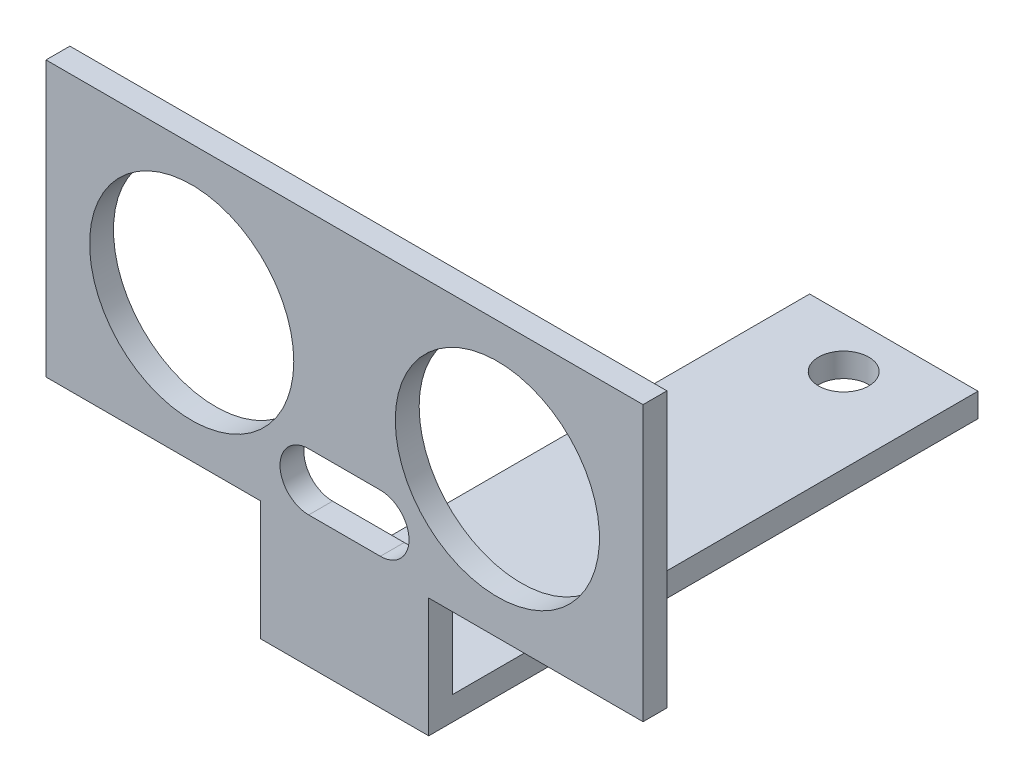
ISO-10303-21;
HEADER;
FILE_DESCRIPTION(('STEP AP214'),'2;1');
FILE_NAME('part.step','',(''),(''),'','','');
FILE_SCHEMA(('AUTOMOTIVE_DESIGN { 1 0 10303 214 1 1 1 1 }'));
ENDSEC;
DATA;
#1=APPLICATION_CONTEXT('core data for automotive mechanical design processes');
#2=APPLICATION_PROTOCOL_DEFINITION('international standard','automotive_design',2000,#1);
#3=PRODUCT_CONTEXT('',#1,'mechanical');
#4=PRODUCT('Part','Part','',(#3));
#5=PRODUCT_RELATED_PRODUCT_CATEGORY('part','',(#4));
#6=PRODUCT_DEFINITION_FORMATION('','',#4);
#7=PRODUCT_DEFINITION_CONTEXT('part definition',#1,'design');
#8=PRODUCT_DEFINITION('design','',#6,#7);
#9=PRODUCT_DEFINITION_SHAPE('','',#8);
#10=(LENGTH_UNIT() NAMED_UNIT(*) SI_UNIT(.MILLI.,.METRE.));
#11=(NAMED_UNIT(*) PLANE_ANGLE_UNIT() SI_UNIT($,.RADIAN.));
#12=(NAMED_UNIT(*) SI_UNIT($,.STERADIAN.) SOLID_ANGLE_UNIT());
#13=UNCERTAINTY_MEASURE_WITH_UNIT(LENGTH_MEASURE(1.E-05),#10,'distance_accuracy_value','');
#14=(GEOMETRIC_REPRESENTATION_CONTEXT(3) GLOBAL_UNCERTAINTY_ASSIGNED_CONTEXT((#13)) GLOBAL_UNIT_ASSIGNED_CONTEXT((#10,
#11,#12)) REPRESENTATION_CONTEXT('',''));
#15=CARTESIAN_POINT('',(0.,0.,0.));
#16=DIRECTION('',(0.,0.,1.));
#17=DIRECTION('',(1.,0.,0.));
#18=AXIS2_PLACEMENT_3D('',#15,#16,#17);
#19=CARTESIAN_POINT('',(0.,2.,0.));
#20=DIRECTION('',(1.,0.,0.));
#21=DIRECTION('',(0.,0.,-1.));
#22=AXIS2_PLACEMENT_3D('',#19,#20,#21);
#23=PLANE('',#22);
#24=DIRECTION('',(0.,0.,1.));
#25=VECTOR('',#24,1.);
#26=CARTESIAN_POINT('',(0.,0.,0.));
#27=LINE('',#26,#25);
#28=CARTESIAN_POINT('',(0.,0.,-46.));
#29=VERTEX_POINT('',#28);
#30=CARTESIAN_POINT('',(0.,0.,0.));
#31=VERTEX_POINT('',#30);
#32=EDGE_CURVE('E236',#29,#31,#27,.T.);
#33=ORIENTED_EDGE('',*,*,#32,.T.);
#34=DIRECTION('',(0.,-1.,0.));
#35=VECTOR('',#34,1.);
#36=CARTESIAN_POINT('',(0.,2.,0.));
#37=LINE('',#36,#35);
#38=CARTESIAN_POINT('',(0.,10.,0.));
#39=VERTEX_POINT('',#38);
#40=EDGE_CURVE('E11',#39,#31,#37,.T.);
#41=ORIENTED_EDGE('',*,*,#40,.F.);
#42=DIRECTION('',(0.,0.,1.));
#43=VECTOR('',#42,1.);
#44=CARTESIAN_POINT('',(0.,10.,-2.));
#45=LINE('',#44,#43);
#46=CARTESIAN_POINT('',(0.,10.,-2.));
#47=VERTEX_POINT('',#46);
#48=EDGE_CURVE('E217',#47,#39,#45,.T.);
#49=ORIENTED_EDGE('',*,*,#48,.F.);
#50=DIRECTION('',(0.,-1.,0.));
#51=VECTOR('',#50,1.);
#52=CARTESIAN_POINT('',(0.,0.,-2.));
#53=LINE('',#52,#51);
#54=CARTESIAN_POINT('',(0.,2.,-2.));
#55=VERTEX_POINT('',#54);
#56=EDGE_CURVE('E182',#47,#55,#53,.T.);
#57=ORIENTED_EDGE('',*,*,#56,.T.);
#58=DIRECTION('',(0.,0.,1.));
#59=VECTOR('',#58,1.);
#60=CARTESIAN_POINT('',(0.,2.,0.));
#61=LINE('',#60,#59);
#62=CARTESIAN_POINT('',(0.,2.,-46.));
#63=VERTEX_POINT('',#62);
#64=EDGE_CURVE('E245',#63,#55,#61,.T.);
#65=ORIENTED_EDGE('',*,*,#64,.F.);
#66=DIRECTION('',(0.,-1.,0.));
#67=VECTOR('',#66,1.);
#68=CARTESIAN_POINT('',(0.,2.,-46.));
#69=LINE('',#68,#67);
#70=EDGE_CURVE('E252',#63,#29,#69,.T.);
#71=ORIENTED_EDGE('',*,*,#70,.T.);
#72=EDGE_LOOP('',(#33,#41,#49,#57,#65,#71));
#73=FACE_BOUND('',#72,.T.);
#74=ADVANCED_FACE('F33',(#73),#23,.F.);
#75=CARTESIAN_POINT('',(0.,2.,0.));
#76=DIRECTION('',(0.,0.,-1.));
#77=DIRECTION('',(-1.,0.,0.));
#78=AXIS2_PLACEMENT_3D('',#75,#76,#77);
#79=PLANE('',#78);
#80=CARTESIAN_POINT('',(19.85,21.5,0.));
#81=DIRECTION('',(0.,0.,1.));
#82=DIRECTION('',(-1.,0.,0.));
#83=AXIS2_PLACEMENT_3D('',#80,#81,#82);
#84=CIRCLE('',#83,8.55000000000001);
#85=CARTESIAN_POINT('',(11.3,21.5,0.));
#86=VERTEX_POINT('',#85);
#87=EDGE_CURVE('E166',#86,#86,#84,.T.);
#88=ORIENTED_EDGE('',*,*,#87,.F.);
#89=EDGE_LOOP('',(#88));
#90=FACE_BOUND('',#89,.T.);
#91=DIRECTION('',(1.,0.,0.));
#92=VECTOR('',#91,1.);
#93=CARTESIAN_POINT('',(4.04999999999999,11.,0.));
#94=LINE('',#93,#92);
#95=CARTESIAN_POINT('',(4.04999999999999,11.,0.));
#96=VERTEX_POINT('',#95);
#97=CARTESIAN_POINT('',(10.05,11.,0.));
#98=VERTEX_POINT('',#97);
#99=EDGE_CURVE('E160',#96,#98,#94,.T.);
#100=ORIENTED_EDGE('',*,*,#99,.F.);
#101=CARTESIAN_POINT('',(4.04999999999999,13.4,0.));
#102=DIRECTION('',(0.,0.,1.));
#103=DIRECTION('',(1.,0.,0.));
#104=AXIS2_PLACEMENT_3D('',#101,#102,#103);
#105=CIRCLE('',#104,2.4);
#106=CARTESIAN_POINT('',(4.04999999999999,15.8,0.));
#107=VERTEX_POINT('',#106);
#108=EDGE_CURVE('E47',#107,#96,#105,.T.);
#109=ORIENTED_EDGE('',*,*,#108,.F.);
#110=DIRECTION('',(-1.,0.,0.));
#111=VECTOR('',#110,1.);
#112=CARTESIAN_POINT('',(4.04999999999999,15.8,0.));
#113=LINE('',#112,#111);
#114=CARTESIAN_POINT('',(10.05,15.8,0.));
#115=VERTEX_POINT('',#114);
#116=EDGE_CURVE('E151',#115,#107,#113,.T.);
#117=ORIENTED_EDGE('',*,*,#116,.F.);
#118=CARTESIAN_POINT('',(10.05,13.4,0.));
#119=DIRECTION('',(0.,0.,1.));
#120=DIRECTION('',(1.,0.,0.));
#121=AXIS2_PLACEMENT_3D('',#118,#119,#120);
#122=CIRCLE('',#121,2.4);
#123=EDGE_CURVE('E154',#98,#115,#122,.T.);
#124=ORIENTED_EDGE('',*,*,#123,.F.);
#125=EDGE_LOOP('',(#100,#109,#117,#124));
#126=FACE_BOUND('',#125,.T.);
#127=CARTESIAN_POINT('',(-5.75000000000001,21.5,0.));
#128=DIRECTION('',(0.,0.,1.));
#129=DIRECTION('',(1.,0.,0.));
#130=AXIS2_PLACEMENT_3D('',#127,#128,#129);
#131=CIRCLE('',#130,8.55000000000001);
#132=CARTESIAN_POINT('',(2.8,21.5,0.));
#133=VERTEX_POINT('',#132);
#134=EDGE_CURVE('E173',#133,#133,#131,.T.);
#135=ORIENTED_EDGE('',*,*,#134,.F.);
#136=EDGE_LOOP('',(#135));
#137=FACE_BOUND('',#136,.T.);
#138=DIRECTION('',(1.,0.,0.));
#139=VECTOR('',#138,1.);
#140=CARTESIAN_POINT('',(0.,0.,0.));
#141=LINE('',#140,#139);
#142=CARTESIAN_POINT('',(14.1,0.,0.));
#143=VERTEX_POINT('',#142);
#144=EDGE_CURVE('E254',#31,#143,#141,.T.);
#145=ORIENTED_EDGE('',*,*,#144,.T.);
#146=DIRECTION('',(0.,-1.,0.));
#147=VECTOR('',#146,1.);
#148=CARTESIAN_POINT('',(14.1,2.,0.));
#149=LINE('',#148,#147);
#150=CARTESIAN_POINT('',(14.1,10.,0.));
#151=VERTEX_POINT('',#150);
#152=EDGE_CURVE('E40',#151,#143,#149,.T.);
#153=ORIENTED_EDGE('',*,*,#152,.F.);
#154=DIRECTION('',(1.,0.,0.));
#155=VECTOR('',#154,1.);
#156=CARTESIAN_POINT('',(32.05,10.,0.));
#157=LINE('',#156,#155);
#158=CARTESIAN_POINT('',(32.05,10.,0.));
#159=VERTEX_POINT('',#158);
#160=EDGE_CURVE('E179',#151,#159,#157,.T.);
#161=ORIENTED_EDGE('',*,*,#160,.T.);
#162=DIRECTION('',(0.,1.,0.));
#163=VECTOR('',#162,1.);
#164=CARTESIAN_POINT('',(32.05,10.,0.));
#165=LINE('',#164,#163);
#166=CARTESIAN_POINT('',(32.05,33.,0.));
#167=VERTEX_POINT('',#166);
#168=EDGE_CURVE('E206',#159,#167,#165,.T.);
#169=ORIENTED_EDGE('',*,*,#168,.T.);
#170=DIRECTION('',(-1.,0.,0.));
#171=VECTOR('',#170,1.);
#172=CARTESIAN_POINT('',(-17.95,33.,0.));
#173=LINE('',#172,#171);
#174=CARTESIAN_POINT('',(-17.95,33.,0.));
#175=VERTEX_POINT('',#174);
#176=EDGE_CURVE('E209',#167,#175,#173,.T.);
#177=ORIENTED_EDGE('',*,*,#176,.T.);
#178=DIRECTION('',(0.,-1.,0.));
#179=VECTOR('',#178,1.);
#180=CARTESIAN_POINT('',(-17.95,10.,0.));
#181=LINE('',#180,#179);
#182=CARTESIAN_POINT('',(-17.95,10.,0.));
#183=VERTEX_POINT('',#182);
#184=EDGE_CURVE('E212',#175,#183,#181,.T.);
#185=ORIENTED_EDGE('',*,*,#184,.T.);
#186=DIRECTION('',(1.,0.,0.));
#187=VECTOR('',#186,1.);
#188=CARTESIAN_POINT('',(-17.95,10.,0.));
#189=LINE('',#188,#187);
#190=EDGE_CURVE('E186',#183,#39,#189,.T.);
#191=ORIENTED_EDGE('',*,*,#190,.T.);
#192=ORIENTED_EDGE('',*,*,#40,.T.);
#193=EDGE_LOOP('',(#145,#153,#161,#169,#177,#185,#191,#192));
#194=FACE_BOUND('',#193,.T.);
#195=ADVANCED_FACE('F296',(#90,#126,#137,#194),#79,.F.);
#196=CARTESIAN_POINT('',(14.1,2.,0.));
#197=DIRECTION('',(-1.,0.,0.));
#198=DIRECTION('',(0.,0.,1.));
#199=AXIS2_PLACEMENT_3D('',#196,#197,#198);
#200=PLANE('',#199);
#201=DIRECTION('',(0.,0.,-1.));
#202=VECTOR('',#201,1.);
#203=CARTESIAN_POINT('',(14.1,2.,0.));
#204=LINE('',#203,#202);
#205=CARTESIAN_POINT('',(14.1,2.,-2.));
#206=VERTEX_POINT('',#205);
#207=CARTESIAN_POINT('',(14.1,2.,-46.));
#208=VERTEX_POINT('',#207);
#209=EDGE_CURVE('E247',#206,#208,#204,.T.);
#210=ORIENTED_EDGE('',*,*,#209,.F.);
#211=DIRECTION('',(0.,1.,0.));
#212=VECTOR('',#211,1.);
#213=CARTESIAN_POINT('',(14.1,0.,-2.));
#214=LINE('',#213,#212);
#215=CARTESIAN_POINT('',(14.1,10.,-2.));
#216=VERTEX_POINT('',#215);
#217=EDGE_CURVE('E185',#206,#216,#214,.T.);
#218=ORIENTED_EDGE('',*,*,#217,.T.);
#219=DIRECTION('',(0.,0.,1.));
#220=VECTOR('',#219,1.);
#221=CARTESIAN_POINT('',(14.1,10.,-2.));
#222=LINE('',#221,#220);
#223=EDGE_CURVE('E203',#216,#151,#222,.T.);
#224=ORIENTED_EDGE('',*,*,#223,.T.);
#225=ORIENTED_EDGE('',*,*,#152,.T.);
#226=DIRECTION('',(0.,0.,-1.));
#227=VECTOR('',#226,1.);
#228=CARTESIAN_POINT('',(14.1,0.,0.));
#229=LINE('',#228,#227);
#230=CARTESIAN_POINT('',(14.1,0.,-46.));
#231=VERTEX_POINT('',#230);
#232=EDGE_CURVE('E256',#143,#231,#229,.T.);
#233=ORIENTED_EDGE('',*,*,#232,.T.);
#234=DIRECTION('',(0.,-1.,0.));
#235=VECTOR('',#234,1.);
#236=CARTESIAN_POINT('',(14.1,2.,-46.));
#237=LINE('',#236,#235);
#238=EDGE_CURVE('E261',#208,#231,#237,.T.);
#239=ORIENTED_EDGE('',*,*,#238,.F.);
#240=EDGE_LOOP('',(#210,#218,#224,#225,#233,#239));
#241=FACE_BOUND('',#240,.T.);
#242=ADVANCED_FACE('F267',(#241),#200,.F.);
#243=CARTESIAN_POINT('',(0.,2.,-46.));
#244=DIRECTION('',(0.,0.,1.));
#245=DIRECTION('',(1.,0.,0.));
#246=AXIS2_PLACEMENT_3D('',#243,#244,#245);
#247=PLANE('',#246);
#248=DIRECTION('',(-1.,0.,0.));
#249=VECTOR('',#248,1.);
#250=CARTESIAN_POINT('',(0.,0.,-46.));
#251=LINE('',#250,#249);
#252=EDGE_CURVE('E248',#231,#29,#251,.T.);
#253=ORIENTED_EDGE('',*,*,#252,.T.);
#254=ORIENTED_EDGE('',*,*,#70,.F.);
#255=DIRECTION('',(-1.,0.,0.));
#256=VECTOR('',#255,1.);
#257=CARTESIAN_POINT('',(0.,2.,-46.));
#258=LINE('',#257,#256);
#259=EDGE_CURVE('E250',#208,#63,#258,.T.);
#260=ORIENTED_EDGE('',*,*,#259,.F.);
#261=ORIENTED_EDGE('',*,*,#238,.T.);
#262=EDGE_LOOP('',(#253,#254,#260,#261));
#263=FACE_BOUND('',#262,.T.);
#264=ADVANCED_FACE('F280',(#263),#247,.F.);
#265=CARTESIAN_POINT('',(0.,2.,0.));
#266=DIRECTION('',(0.,-1.,0.));
#267=DIRECTION('',(0.,0.,-1.));
#268=AXIS2_PLACEMENT_3D('',#265,#266,#267);
#269=PLANE('',#268);
#270=CARTESIAN_POINT('',(7.05,2.,-10.1));
#271=DIRECTION('',(0.,1.,0.));
#272=DIRECTION('',(0.,0.,1.));
#273=AXIS2_PLACEMENT_3D('',#270,#271,#272);
#274=CIRCLE('',#273,2.1);
#275=CARTESIAN_POINT('',(7.05,2.,-8.));
#276=VERTEX_POINT('',#275);
#277=EDGE_CURVE('E237',#276,#276,#274,.T.);
#278=ORIENTED_EDGE('',*,*,#277,.F.);
#279=EDGE_LOOP('',(#278));
#280=FACE_BOUND('',#279,.T.);
#281=CARTESIAN_POINT('',(7.05,2.,-41.8));
#282=DIRECTION('',(0.,1.,0.));
#283=DIRECTION('',(0.,0.,1.));
#284=AXIS2_PLACEMENT_3D('',#281,#282,#283);
#285=CIRCLE('',#284,2.1);
#286=CARTESIAN_POINT('',(7.05,2.,-39.7));
#287=VERTEX_POINT('',#286);
#288=EDGE_CURVE('E232',#287,#287,#285,.T.);
#289=ORIENTED_EDGE('',*,*,#288,.F.);
#290=EDGE_LOOP('',(#289));
#291=FACE_BOUND('',#290,.T.);
#292=ORIENTED_EDGE('',*,*,#64,.T.);
#293=DIRECTION('',(1.,0.,0.));
#294=VECTOR('',#293,1.);
#295=CARTESIAN_POINT('',(0.,2.,-2.));
#296=LINE('',#295,#294);
#297=EDGE_CURVE('E220',#55,#206,#296,.T.);
#298=ORIENTED_EDGE('',*,*,#297,.T.);
#299=ORIENTED_EDGE('',*,*,#209,.T.);
#300=ORIENTED_EDGE('',*,*,#259,.T.);
#301=EDGE_LOOP('',(#292,#298,#299,#300));
#302=FACE_BOUND('',#301,.T.);
#303=ADVANCED_FACE('F287',(#280,#291,#302),#269,.F.);
#304=CARTESIAN_POINT('',(0.,0.,0.));
#305=DIRECTION('',(0.,-1.,0.));
#306=DIRECTION('',(0.,0.,-1.));
#307=AXIS2_PLACEMENT_3D('',#304,#305,#306);
#308=PLANE('',#307);
#309=ORIENTED_EDGE('',*,*,#252,.F.);
#310=ORIENTED_EDGE('',*,*,#232,.F.);
#311=ORIENTED_EDGE('',*,*,#144,.F.);
#312=ORIENTED_EDGE('',*,*,#32,.F.);
#313=EDGE_LOOP('',(#309,#310,#311,#312));
#314=FACE_BOUND('',#313,.T.);
#315=CARTESIAN_POINT('',(7.05,0.,-10.1));
#316=DIRECTION('',(0.,1.,0.));
#317=DIRECTION('',(0.,0.,1.));
#318=AXIS2_PLACEMENT_3D('',#315,#316,#317);
#319=CIRCLE('',#318,2.1);
#320=CARTESIAN_POINT('',(7.05,0.,-8.));
#321=VERTEX_POINT('',#320);
#322=EDGE_CURVE('E233',#321,#321,#319,.T.);
#323=ORIENTED_EDGE('',*,*,#322,.T.);
#324=EDGE_LOOP('',(#323));
#325=FACE_BOUND('',#324,.T.);
#326=CARTESIAN_POINT('',(7.05,0.,-41.8));
#327=DIRECTION('',(0.,1.,0.));
#328=DIRECTION('',(0.,0.,1.));
#329=AXIS2_PLACEMENT_3D('',#326,#327,#328);
#330=CIRCLE('',#329,2.1);
#331=CARTESIAN_POINT('',(7.05,0.,-39.7));
#332=VERTEX_POINT('',#331);
#333=EDGE_CURVE('E240',#332,#332,#330,.T.);
#334=ORIENTED_EDGE('',*,*,#333,.T.);
#335=EDGE_LOOP('',(#334));
#336=FACE_BOUND('',#335,.T.);
#337=ADVANCED_FACE('F275',(#314,#325,#336),#308,.T.);
#338=CARTESIAN_POINT('',(7.05,0.,-41.8));
#339=DIRECTION('',(0.,1.,0.));
#340=DIRECTION('',(0.,0.,1.));
#341=AXIS2_PLACEMENT_3D('',#338,#339,#340);
#342=CYLINDRICAL_SURFACE('',#341,2.1);
#343=ORIENTED_EDGE('',*,*,#333,.F.);
#344=EDGE_LOOP('',(#343));
#345=FACE_BOUND('',#344,.T.);
#346=ORIENTED_EDGE('',*,*,#288,.T.);
#347=EDGE_LOOP('',(#346));
#348=FACE_BOUND('',#347,.T.);
#349=ADVANCED_FACE('F336',(#345,#348),#342,.F.);
#350=CARTESIAN_POINT('',(7.05,0.,-10.1));
#351=DIRECTION('',(0.,1.,0.));
#352=DIRECTION('',(0.,0.,1.));
#353=AXIS2_PLACEMENT_3D('',#350,#351,#352);
#354=CYLINDRICAL_SURFACE('',#353,2.1);
#355=ORIENTED_EDGE('',*,*,#322,.F.);
#356=EDGE_LOOP('',(#355));
#357=FACE_BOUND('',#356,.T.);
#358=ORIENTED_EDGE('',*,*,#277,.T.);
#359=EDGE_LOOP('',(#358));
#360=FACE_BOUND('',#359,.T.);
#361=ADVANCED_FACE('F317',(#357,#360),#354,.F.);
#362=CARTESIAN_POINT('',(0.,0.,-2.));
#363=DIRECTION('',(0.,0.,-1.));
#364=DIRECTION('',(-1.,0.,0.));
#365=AXIS2_PLACEMENT_3D('',#362,#363,#364);
#366=PLANE('',#365);
#367=CARTESIAN_POINT('',(19.85,21.5,-2.));
#368=DIRECTION('',(0.,0.,1.));
#369=DIRECTION('',(-1.,0.,0.));
#370=AXIS2_PLACEMENT_3D('',#367,#368,#369);
#371=CIRCLE('',#370,8.55000000000001);
#372=CARTESIAN_POINT('',(11.3,21.5,-2.));
#373=VERTEX_POINT('',#372);
#374=EDGE_CURVE('E170',#373,#373,#371,.T.);
#375=ORIENTED_EDGE('',*,*,#374,.T.);
#376=EDGE_LOOP('',(#375));
#377=FACE_BOUND('',#376,.T.);
#378=CARTESIAN_POINT('',(4.04999999999999,13.4,-2.));
#379=DIRECTION('',(0.,0.,1.));
#380=DIRECTION('',(1.,0.,0.));
#381=AXIS2_PLACEMENT_3D('',#378,#379,#380);
#382=CIRCLE('',#381,2.4);
#383=CARTESIAN_POINT('',(4.04999999999999,15.8,-2.));
#384=VERTEX_POINT('',#383);
#385=CARTESIAN_POINT('',(4.04999999999999,11.,-2.));
#386=VERTEX_POINT('',#385);
#387=EDGE_CURVE('E135',#384,#386,#382,.T.);
#388=ORIENTED_EDGE('',*,*,#387,.T.);
#389=DIRECTION('',(1.,0.,0.));
#390=VECTOR('',#389,1.);
#391=CARTESIAN_POINT('',(4.04999999999999,11.,-2.));
#392=LINE('',#391,#390);
#393=CARTESIAN_POINT('',(10.05,11.,-2.));
#394=VERTEX_POINT('',#393);
#395=EDGE_CURVE('E144',#386,#394,#392,.T.);
#396=ORIENTED_EDGE('',*,*,#395,.T.);
#397=CARTESIAN_POINT('',(10.05,13.4,-2.));
#398=DIRECTION('',(0.,0.,1.));
#399=DIRECTION('',(1.,0.,0.));
#400=AXIS2_PLACEMENT_3D('',#397,#398,#399);
#401=CIRCLE('',#400,2.4);
#402=CARTESIAN_POINT('',(10.05,15.8,-2.));
#403=VERTEX_POINT('',#402);
#404=EDGE_CURVE('E55',#394,#403,#401,.T.);
#405=ORIENTED_EDGE('',*,*,#404,.T.);
#406=DIRECTION('',(-1.,0.,0.));
#407=VECTOR('',#406,1.);
#408=CARTESIAN_POINT('',(4.04999999999999,15.8,-2.));
#409=LINE('',#408,#407);
#410=EDGE_CURVE('E141',#403,#384,#409,.T.);
#411=ORIENTED_EDGE('',*,*,#410,.T.);
#412=EDGE_LOOP('',(#388,#396,#405,#411));
#413=FACE_BOUND('',#412,.T.);
#414=CARTESIAN_POINT('',(-5.75000000000001,21.5,-2.));
#415=DIRECTION('',(0.,0.,1.));
#416=DIRECTION('',(1.,0.,0.));
#417=AXIS2_PLACEMENT_3D('',#414,#415,#416);
#418=CIRCLE('',#417,8.55000000000001);
#419=CARTESIAN_POINT('',(2.8,21.5,-2.));
#420=VERTEX_POINT('',#419);
#421=EDGE_CURVE('E176',#420,#420,#418,.T.);
#422=ORIENTED_EDGE('',*,*,#421,.T.);
#423=EDGE_LOOP('',(#422));
#424=FACE_BOUND('',#423,.T.);
#425=ORIENTED_EDGE('',*,*,#297,.F.);
#426=ORIENTED_EDGE('',*,*,#56,.F.);
#427=DIRECTION('',(1.,0.,0.));
#428=VECTOR('',#427,1.);
#429=CARTESIAN_POINT('',(-17.95,10.,-2.));
#430=LINE('',#429,#428);
#431=CARTESIAN_POINT('',(-17.95,10.,-2.));
#432=VERTEX_POINT('',#431);
#433=EDGE_CURVE('E200',#432,#47,#430,.T.);
#434=ORIENTED_EDGE('',*,*,#433,.F.);
#435=DIRECTION('',(0.,-1.,0.));
#436=VECTOR('',#435,1.);
#437=CARTESIAN_POINT('',(-17.95,10.,-2.));
#438=LINE('',#437,#436);
#439=CARTESIAN_POINT('',(-17.95,33.,-2.));
#440=VERTEX_POINT('',#439);
#441=EDGE_CURVE('E197',#440,#432,#438,.T.);
#442=ORIENTED_EDGE('',*,*,#441,.F.);
#443=DIRECTION('',(-1.,0.,0.));
#444=VECTOR('',#443,1.);
#445=CARTESIAN_POINT('',(-17.95,33.,-2.));
#446=LINE('',#445,#444);
#447=CARTESIAN_POINT('',(32.05,33.,-2.));
#448=VERTEX_POINT('',#447);
#449=EDGE_CURVE('E194',#448,#440,#446,.T.);
#450=ORIENTED_EDGE('',*,*,#449,.F.);
#451=DIRECTION('',(0.,1.,0.));
#452=VECTOR('',#451,1.);
#453=CARTESIAN_POINT('',(32.05,10.,-2.));
#454=LINE('',#453,#452);
#455=CARTESIAN_POINT('',(32.05,10.,-2.));
#456=VERTEX_POINT('',#455);
#457=EDGE_CURVE('E191',#456,#448,#454,.T.);
#458=ORIENTED_EDGE('',*,*,#457,.F.);
#459=DIRECTION('',(1.,0.,0.));
#460=VECTOR('',#459,1.);
#461=CARTESIAN_POINT('',(32.05,10.,-2.));
#462=LINE('',#461,#460);
#463=EDGE_CURVE('E188',#216,#456,#462,.T.);
#464=ORIENTED_EDGE('',*,*,#463,.F.);
#465=ORIENTED_EDGE('',*,*,#217,.F.);
#466=EDGE_LOOP('',(#425,#426,#434,#442,#450,#458,#464,#465));
#467=FACE_BOUND('',#466,.T.);
#468=ADVANCED_FACE('F148',(#377,#413,#424,#467),#366,.T.);
#469=CARTESIAN_POINT('',(-17.95,10.,-2.));
#470=DIRECTION('',(0.,-1.,0.));
#471=DIRECTION('',(1.,0.,0.));
#472=AXIS2_PLACEMENT_3D('',#469,#470,#471);
#473=PLANE('',#472);
#474=ORIENTED_EDGE('',*,*,#190,.F.);
#475=DIRECTION('',(0.,0.,1.));
#476=VECTOR('',#475,1.);
#477=CARTESIAN_POINT('',(-17.95,10.,-2.));
#478=LINE('',#477,#476);
#479=EDGE_CURVE('E221',#432,#183,#478,.T.);
#480=ORIENTED_EDGE('',*,*,#479,.F.);
#481=ORIENTED_EDGE('',*,*,#433,.T.);
#482=ORIENTED_EDGE('',*,*,#48,.T.);
#483=EDGE_LOOP('',(#474,#480,#481,#482));
#484=FACE_BOUND('',#483,.T.);
#485=ADVANCED_FACE('F309',(#484),#473,.T.);
#486=CARTESIAN_POINT('',(-17.95,10.,-2.));
#487=DIRECTION('',(-1.,0.,0.));
#488=DIRECTION('',(0.,-1.,0.));
#489=AXIS2_PLACEMENT_3D('',#486,#487,#488);
#490=PLANE('',#489);
#491=ORIENTED_EDGE('',*,*,#184,.F.);
#492=DIRECTION('',(0.,0.,1.));
#493=VECTOR('',#492,1.);
#494=CARTESIAN_POINT('',(-17.95,33.,-2.));
#495=LINE('',#494,#493);
#496=EDGE_CURVE('E223',#440,#175,#495,.T.);
#497=ORIENTED_EDGE('',*,*,#496,.F.);
#498=ORIENTED_EDGE('',*,*,#441,.T.);
#499=ORIENTED_EDGE('',*,*,#479,.T.);
#500=EDGE_LOOP('',(#491,#497,#498,#499));
#501=FACE_BOUND('',#500,.T.);
#502=ADVANCED_FACE('F306',(#501),#490,.T.);
#503=CARTESIAN_POINT('',(-17.95,33.,-2.));
#504=DIRECTION('',(0.,1.,0.));
#505=DIRECTION('',(-1.,0.,0.));
#506=AXIS2_PLACEMENT_3D('',#503,#504,#505);
#507=PLANE('',#506);
#508=ORIENTED_EDGE('',*,*,#176,.F.);
#509=DIRECTION('',(0.,0.,1.));
#510=VECTOR('',#509,1.);
#511=CARTESIAN_POINT('',(32.05,33.,-2.));
#512=LINE('',#511,#510);
#513=EDGE_CURVE('E225',#448,#167,#512,.T.);
#514=ORIENTED_EDGE('',*,*,#513,.F.);
#515=ORIENTED_EDGE('',*,*,#449,.T.);
#516=ORIENTED_EDGE('',*,*,#496,.T.);
#517=EDGE_LOOP('',(#508,#514,#515,#516));
#518=FACE_BOUND('',#517,.T.);
#519=ADVANCED_FACE('F302',(#518),#507,.T.);
#520=CARTESIAN_POINT('',(32.05,10.,-2.));
#521=DIRECTION('',(1.,0.,0.));
#522=DIRECTION('',(0.,0.,-1.));
#523=AXIS2_PLACEMENT_3D('',#520,#521,#522);
#524=PLANE('',#523);
#525=ORIENTED_EDGE('',*,*,#168,.F.);
#526=DIRECTION('',(0.,0.,1.));
#527=VECTOR('',#526,1.);
#528=CARTESIAN_POINT('',(32.05,10.,-2.));
#529=LINE('',#528,#527);
#530=EDGE_CURVE('E227',#456,#159,#529,.T.);
#531=ORIENTED_EDGE('',*,*,#530,.F.);
#532=ORIENTED_EDGE('',*,*,#457,.T.);
#533=ORIENTED_EDGE('',*,*,#513,.T.);
#534=EDGE_LOOP('',(#525,#531,#532,#533));
#535=FACE_BOUND('',#534,.T.);
#536=ADVANCED_FACE('F299',(#535),#524,.T.);
#537=CARTESIAN_POINT('',(32.05,10.,-2.));
#538=DIRECTION('',(0.,-1.,0.));
#539=DIRECTION('',(1.,0.,0.));
#540=AXIS2_PLACEMENT_3D('',#537,#538,#539);
#541=PLANE('',#540);
#542=ORIENTED_EDGE('',*,*,#160,.F.);
#543=ORIENTED_EDGE('',*,*,#223,.F.);
#544=ORIENTED_EDGE('',*,*,#463,.T.);
#545=ORIENTED_EDGE('',*,*,#530,.T.);
#546=EDGE_LOOP('',(#542,#543,#544,#545));
#547=FACE_BOUND('',#546,.T.);
#548=ADVANCED_FACE('F294',(#547),#541,.T.);
#549=CARTESIAN_POINT('',(-5.75000000000001,21.5,-2.));
#550=DIRECTION('',(0.,0.,1.));
#551=DIRECTION('',(1.,0.,0.));
#552=AXIS2_PLACEMENT_3D('',#549,#550,#551);
#553=CYLINDRICAL_SURFACE('',#552,8.55000000000001);
#554=ORIENTED_EDGE('',*,*,#421,.F.);
#555=EDGE_LOOP('',(#554));
#556=FACE_BOUND('',#555,.T.);
#557=ORIENTED_EDGE('',*,*,#134,.T.);
#558=EDGE_LOOP('',(#557));
#559=FACE_BOUND('',#558,.T.);
#560=ADVANCED_FACE('F348',(#556,#559),#553,.F.);
#561=CARTESIAN_POINT('',(4.04999999999999,13.4,-2.));
#562=DIRECTION('',(0.,0.,1.));
#563=DIRECTION('',(1.,0.,0.));
#564=AXIS2_PLACEMENT_3D('',#561,#562,#563);
#565=CYLINDRICAL_SURFACE('',#564,2.4);
#566=ORIENTED_EDGE('',*,*,#108,.T.);
#567=DIRECTION('',(0.,0.,1.));
#568=VECTOR('',#567,1.);
#569=CARTESIAN_POINT('',(4.04999999999999,11.,-2.));
#570=LINE('',#569,#568);
#571=EDGE_CURVE('E131',#386,#96,#570,.T.);
#572=ORIENTED_EDGE('',*,*,#571,.F.);
#573=ORIENTED_EDGE('',*,*,#387,.F.);
#574=DIRECTION('',(0.,0.,1.));
#575=VECTOR('',#574,1.);
#576=CARTESIAN_POINT('',(4.04999999999999,15.8,-2.));
#577=LINE('',#576,#575);
#578=EDGE_CURVE('E164',#384,#107,#577,.T.);
#579=ORIENTED_EDGE('',*,*,#578,.T.);
#580=EDGE_LOOP('',(#566,#572,#573,#579));
#581=FACE_BOUND('',#580,.T.);
#582=ADVANCED_FACE('F133',(#581),#565,.F.);
#583=CARTESIAN_POINT('',(4.04999999999999,15.8,-2.));
#584=DIRECTION('',(0.,1.,0.));
#585=DIRECTION('',(0.,0.,1.));
#586=AXIS2_PLACEMENT_3D('',#583,#584,#585);
#587=PLANE('',#586);
#588=ORIENTED_EDGE('',*,*,#116,.T.);
#589=ORIENTED_EDGE('',*,*,#578,.F.);
#590=ORIENTED_EDGE('',*,*,#410,.F.);
#591=DIRECTION('',(0.,0.,1.));
#592=VECTOR('',#591,1.);
#593=CARTESIAN_POINT('',(10.05,15.8,-2.));
#594=LINE('',#593,#592);
#595=EDGE_CURVE('E167',#403,#115,#594,.T.);
#596=ORIENTED_EDGE('',*,*,#595,.T.);
#597=EDGE_LOOP('',(#588,#589,#590,#596));
#598=FACE_BOUND('',#597,.T.);
#599=ADVANCED_FACE('F378',(#598),#587,.F.);
#600=CARTESIAN_POINT('',(10.05,13.4,-2.));
#601=DIRECTION('',(0.,0.,1.));
#602=DIRECTION('',(1.,0.,0.));
#603=AXIS2_PLACEMENT_3D('',#600,#601,#602);
#604=CYLINDRICAL_SURFACE('',#603,2.4);
#605=ORIENTED_EDGE('',*,*,#123,.T.);
#606=ORIENTED_EDGE('',*,*,#595,.F.);
#607=ORIENTED_EDGE('',*,*,#404,.F.);
#608=DIRECTION('',(0.,0.,1.));
#609=VECTOR('',#608,1.);
#610=CARTESIAN_POINT('',(10.05,11.,-2.));
#611=LINE('',#610,#609);
#612=EDGE_CURVE('E140',#394,#98,#611,.T.);
#613=ORIENTED_EDGE('',*,*,#612,.T.);
#614=EDGE_LOOP('',(#605,#606,#607,#613));
#615=FACE_BOUND('',#614,.T.);
#616=ADVANCED_FACE('F385',(#615),#604,.F.);
#617=CARTESIAN_POINT('',(4.04999999999999,11.,-2.));
#618=DIRECTION('',(0.,-1.,0.));
#619=DIRECTION('',(0.,0.,-1.));
#620=AXIS2_PLACEMENT_3D('',#617,#618,#619);
#621=PLANE('',#620);
#622=ORIENTED_EDGE('',*,*,#99,.T.);
#623=ORIENTED_EDGE('',*,*,#612,.F.);
#624=ORIENTED_EDGE('',*,*,#395,.F.);
#625=ORIENTED_EDGE('',*,*,#571,.T.);
#626=EDGE_LOOP('',(#622,#623,#624,#625));
#627=FACE_BOUND('',#626,.T.);
#628=ADVANCED_FACE('F145',(#627),#621,.F.);
#629=CARTESIAN_POINT('',(19.85,21.5,-2.));
#630=DIRECTION('',(0.,0.,1.));
#631=DIRECTION('',(1.,0.,0.));
#632=AXIS2_PLACEMENT_3D('',#629,#630,#631);
#633=CYLINDRICAL_SURFACE('',#632,8.55000000000001);
#634=ORIENTED_EDGE('',*,*,#374,.F.);
#635=EDGE_LOOP('',(#634));
#636=FACE_BOUND('',#635,.T.);
#637=ORIENTED_EDGE('',*,*,#87,.T.);
#638=EDGE_LOOP('',(#637));
#639=FACE_BOUND('',#638,.T.);
#640=ADVANCED_FACE('F399',(#636,#639),#633,.F.);
#641=CLOSED_SHELL('',(#74,#195,#242,#264,#303,#337,#349,#361,#468,#485,#502,#519,#536,#548,#560,
#582,#599,#616,#628,#640));
#642=MANIFOLD_SOLID_BREP('B2',#641);
#643=ADVANCED_BREP_SHAPE_REPRESENTATION('',(#18,#642),#14);
#644=SHAPE_DEFINITION_REPRESENTATION(#9,#643);
ENDSEC;
END-ISO-10303-21;
